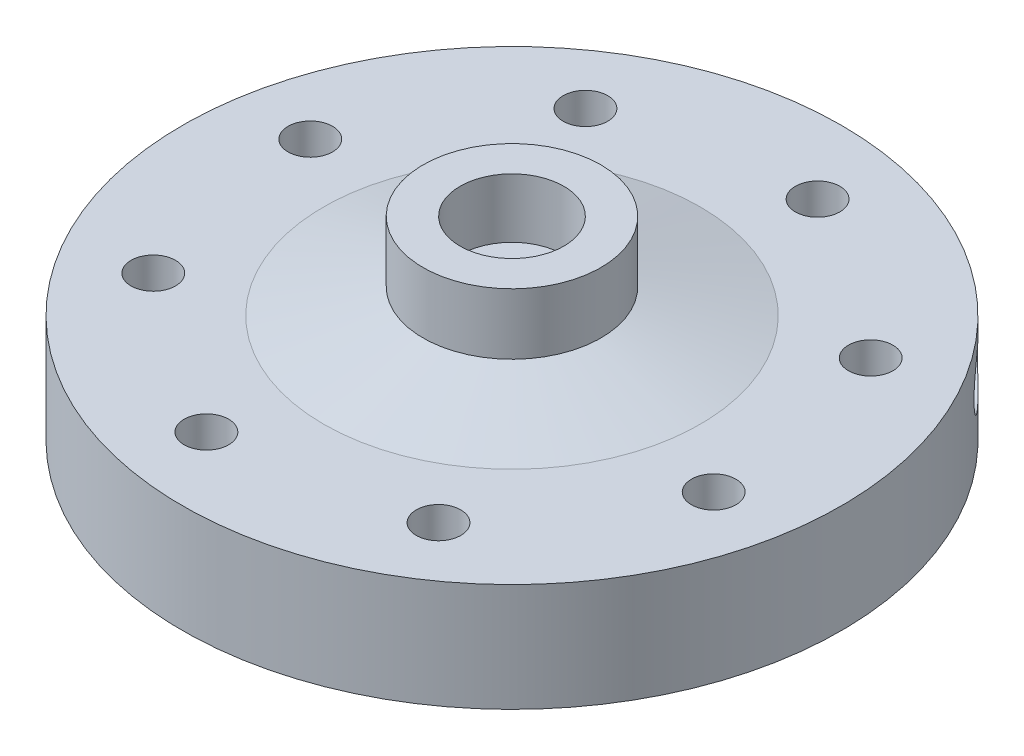
ISO-10303-21;
HEADER;
FILE_DESCRIPTION(('STEP AP214'),'2;1');
FILE_NAME('part.step','',(''),(''),'','','');
FILE_SCHEMA(('AUTOMOTIVE_DESIGN { 1 0 10303 214 1 1 1 1 }'));
ENDSEC;
DATA;
#1=APPLICATION_CONTEXT('core data for automotive mechanical design processes');
#2=APPLICATION_PROTOCOL_DEFINITION('international standard','automotive_design',2000,#1);
#3=PRODUCT_CONTEXT('',#1,'mechanical');
#4=PRODUCT('Part','Part','',(#3));
#5=PRODUCT_RELATED_PRODUCT_CATEGORY('part','',(#4));
#6=PRODUCT_DEFINITION_FORMATION('','',#4);
#7=PRODUCT_DEFINITION_CONTEXT('part definition',#1,'design');
#8=PRODUCT_DEFINITION('design','',#6,#7);
#9=PRODUCT_DEFINITION_SHAPE('','',#8);
#10=(LENGTH_UNIT() NAMED_UNIT(*) SI_UNIT(.MILLI.,.METRE.));
#11=(NAMED_UNIT(*) PLANE_ANGLE_UNIT() SI_UNIT($,.RADIAN.));
#12=(NAMED_UNIT(*) SI_UNIT($,.STERADIAN.) SOLID_ANGLE_UNIT());
#13=UNCERTAINTY_MEASURE_WITH_UNIT(LENGTH_MEASURE(1.E-05),#10,'distance_accuracy_value','');
#14=(GEOMETRIC_REPRESENTATION_CONTEXT(3) GLOBAL_UNCERTAINTY_ASSIGNED_CONTEXT((#13)) GLOBAL_UNIT_ASSIGNED_CONTEXT((#10,
#11,#12)) REPRESENTATION_CONTEXT('',''));
#15=CARTESIAN_POINT('',(0.,0.,0.));
#16=DIRECTION('',(0.,0.,1.));
#17=DIRECTION('',(1.,0.,0.));
#18=AXIS2_PLACEMENT_3D('',#15,#16,#17);
#19=CARTESIAN_POINT('',(0.,21.1893026219228,0.));
#20=DIRECTION('',(0.,1.,0.));
#21=DIRECTION('',(0.,0.,1.));
#22=AXIS2_PLACEMENT_3D('',#19,#20,#21);
#23=PLANE('',#22);
#24=CARTESIAN_POINT('',(0.,21.1893026219228,0.));
#25=DIRECTION('',(0.,1.,0.));
#26=DIRECTION('',(0.,0.,1.));
#27=AXIS2_PLACEMENT_3D('',#24,#25,#26);
#28=CIRCLE('',#27,7.);
#29=CARTESIAN_POINT('',(0.,21.1893026219228,7.));
#30=VERTEX_POINT('',#29);
#31=EDGE_CURVE('E115',#30,#30,#28,.T.);
#32=ORIENTED_EDGE('',*,*,#31,.F.);
#33=EDGE_LOOP('',(#32));
#34=FACE_BOUND('',#33,.T.);
#35=CARTESIAN_POINT('',(0.,21.1893026219228,0.));
#36=DIRECTION('',(0.,-1.,0.));
#37=DIRECTION('',(0.,0.,-1.));
#38=AXIS2_PLACEMENT_3D('',#35,#36,#37);
#39=CIRCLE('',#38,12.);
#40=CARTESIAN_POINT('',(0.,21.1893026219228,-12.));
#41=VERTEX_POINT('',#40);
#42=EDGE_CURVE('E118',#41,#41,#39,.T.);
#43=ORIENTED_EDGE('',*,*,#42,.F.);
#44=EDGE_LOOP('',(#43));
#45=FACE_BOUND('',#44,.T.);
#46=ADVANCED_FACE('F34',(#34,#45),#23,.T.);
#47=CARTESIAN_POINT('',(0.,21.1893026219228,0.));
#48=DIRECTION('',(0.,-1.,0.));
#49=DIRECTION('',(0.,0.,-1.));
#50=AXIS2_PLACEMENT_3D('',#47,#48,#49);
#51=CYLINDRICAL_SURFACE('',#50,44.45);
#52=CARTESIAN_POINT('',(0.,9.58290033894912,0.));
#53=DIRECTION('',(0.,-1.,0.));
#54=DIRECTION('',(0.,0.,-1.));
#55=AXIS2_PLACEMENT_3D('',#52,#53,#54);
#56=CIRCLE('',#55,44.45);
#57=CARTESIAN_POINT('',(0.,9.58290033894912,-44.45));
#58=VERTEX_POINT('',#57);
#59=EDGE_CURVE('E60',#58,#58,#56,.T.);
#60=ORIENTED_EDGE('',*,*,#59,.T.);
#61=EDGE_LOOP('',(#60));
#62=FACE_BOUND('',#61,.T.);
#63=CARTESIAN_POINT('',(29.9319374510654,2.92587753145361,-32.8615523130833));
#64=CARTESIAN_POINT('',(29.8959334541763,3.08996745976612,-32.8943472882046));
#65=CARTESIAN_POINT('',(29.8698406517045,3.25812870608102,-32.918012326472));
#66=CARTESIAN_POINT('',(29.8390810721533,3.59803129591487,-32.9458978715955));
#67=CARTESIAN_POINT('',(29.8344178203927,3.76977322381451,-32.9501151791572));
#68=CARTESIAN_POINT('',(29.8468160101363,4.11178029325182,-32.9388848775177));
#69=CARTESIAN_POINT('',(29.8638731600843,4.28204571982786,-32.923441152979));
#70=CARTESIAN_POINT('',(29.9186443721799,4.61634764342194,-32.8736757873706));
#71=CARTESIAN_POINT('',(29.9563617542599,4.78038313480842,-32.839351112281));
#72=CARTESIAN_POINT('',(30.0508826711284,5.10006916125842,-32.7528787338816));
#73=CARTESIAN_POINT('',(30.1079042863796,5.2555991807501,-32.7005272600508));
#74=CARTESIAN_POINT('',(30.2381423844797,5.55316359074421,-32.5801333615735));
#75=CARTESIAN_POINT('',(30.3113639334116,5.69519373962693,-32.5120860281955));
#76=CARTESIAN_POINT('',(30.479763231903,5.97825923657682,-32.354307347965));
#77=CARTESIAN_POINT('',(30.5764596653527,6.11752289202571,-32.2630261580549));
#78=CARTESIAN_POINT('',(30.7824900910937,6.37526544205093,-32.0665104857453));
#79=CARTESIAN_POINT('',(30.8918307874186,6.49373322599226,-31.9612685969425));
#80=CARTESIAN_POINT('',(31.1366204327815,6.72461375894985,-31.7229662073693));
#81=CARTESIAN_POINT('',(31.2735464781962,6.83358955534002,-31.5880895514265));
#82=CARTESIAN_POINT('',(31.5554450570525,7.02176215344529,-31.3064875020951));
#83=CARTESIAN_POINT('',(31.7004219692208,7.10094256427749,-31.159755640735));
#84=CARTESIAN_POINT('',(32.011943416216,7.23608818044641,-30.8398014219607));
#85=CARTESIAN_POINT('',(32.1790277116903,7.2882564762932,-30.6654876939502));
#86=CARTESIAN_POINT('',(32.5138613076038,7.35310948024676,-30.3102460893369));
#87=CARTESIAN_POINT('',(32.6816108145007,7.36578078148028,-30.1293159879497));
#88=CARTESIAN_POINT('',(33.0191207519525,7.35015011928141,-29.7591130066244));
#89=CARTESIAN_POINT('',(33.188749832493,7.3204148536562,-29.569768114535));
#90=CARTESIAN_POINT('',(33.4360796467411,7.24260767754938,-29.2890225263445));
#91=CARTESIAN_POINT('',(33.5173793061825,7.21111188538967,-29.1959365205569));
#92=CARTESIAN_POINT('',(33.6769987650302,7.13702521866445,-29.0116708490032));
#93=CARTESIAN_POINT('',(33.7553200979625,7.09444014505164,-28.9204902133721));
#94=CARTESIAN_POINT('',(33.9043660981399,7.00072240675448,-28.7455907940928));
#95=CARTESIAN_POINT('',(33.9752741700074,6.95014544382026,-28.6617299433563));
#96=CARTESIAN_POINT('',(34.1132151213295,6.83923725805802,-28.4974130351109));
#97=CARTESIAN_POINT('',(34.1802500245553,6.77891119296619,-28.4169552054864));
#98=CARTESIAN_POINT('',(34.3099008180338,6.64873819896556,-28.2602821797415));
#99=CARTESIAN_POINT('',(34.3725167100777,6.57889127391572,-28.1840669819015));
#100=CARTESIAN_POINT('',(34.4927226402088,6.4300914093142,-28.0368260137797));
#101=CARTESIAN_POINT('',(34.5503155400245,6.35114371502683,-27.9657972924328));
#102=CARTESIAN_POINT('',(34.6547231624174,6.19257754218728,-27.8362876716617));
#103=CARTESIAN_POINT('',(34.7020419837502,6.11373981209024,-27.7772560422544));
#104=CARTESIAN_POINT('',(34.7917209485113,5.94954751609226,-27.6648481161933));
#105=CARTESIAN_POINT('',(34.834083678742,5.86419638860673,-27.6114688707041));
#106=CARTESIAN_POINT('',(34.9134967913379,5.68756219723673,-27.5109858890268));
#107=CARTESIAN_POINT('',(34.9505484114628,5.59628052270264,-27.4638806908471));
#108=CARTESIAN_POINT('',(35.0190131261827,5.40847105486403,-27.3765282995191));
#109=CARTESIAN_POINT('',(35.0504266366752,5.31194364919806,-27.3362806005355));
#110=CARTESIAN_POINT('',(35.1048195786324,5.12313131257556,-27.2663882435744));
#111=CARTESIAN_POINT('',(35.1282976223976,5.03121914910969,-27.2361225843593));
#112=CARTESIAN_POINT('',(35.1701404712617,4.84433535731343,-27.1820692414821));
#113=CARTESIAN_POINT('',(35.1885034795302,4.74936266690679,-27.1582838342933));
#114=CARTESIAN_POINT('',(35.2199422882794,4.55717428744205,-27.1175004963679));
#115=CARTESIAN_POINT('',(35.2330217171778,4.45996018630107,-27.1004979077343));
#116=CARTESIAN_POINT('',(35.2538095071216,4.26399228899056,-27.0734499265245));
#117=CARTESIAN_POINT('',(35.2615159527482,4.16523795655616,-27.0634070150166));
#118=CARTESIAN_POINT('',(35.2759268647847,3.87824588832216,-27.0446267889823));
#119=CARTESIAN_POINT('',(35.2755800602276,3.68891581473742,-27.045078425231));
#120=CARTESIAN_POINT('',(35.2552885487423,3.3132404029546,-27.0715232177343));
#121=CARTESIAN_POINT('',(35.2353463065054,3.12689469238254,-27.0975131618104));
#122=CARTESIAN_POINT('',(35.1768155881201,2.76444513569196,-27.1734501443475));
#123=CARTESIAN_POINT('',(35.138440258913,2.58824938318097,-27.2231232799882));
#124=CARTESIAN_POINT('',(35.0442292053705,2.24852073576567,-27.3442928850559));
#125=CARTESIAN_POINT('',(34.9883922771803,2.08498871490699,-27.4157908591443));
#126=CARTESIAN_POINT('',(34.8590672833632,1.77032966578616,-27.5800489677924));
#127=CARTESIAN_POINT('',(34.7851472492575,1.61965113561621,-27.673326412974));
#128=CARTESIAN_POINT('',(34.622491300943,1.33900342439487,-27.8765584735258));
#129=CARTESIAN_POINT('',(34.5337521580806,1.20903876838094,-27.9865167226795));
#130=CARTESIAN_POINT('',(34.3379189149704,0.964943060613875,-28.2264977777086));
#131=CARTESIAN_POINT('',(34.2300405121252,0.852240006286304,-28.3573308024269));
#132=CARTESIAN_POINT('',(34.0028439200075,0.654273227869451,-28.6293648562107));
#133=CARTESIAN_POINT('',(33.8835218692917,0.569018808384937,-28.7705693811537));
#134=CARTESIAN_POINT('',(33.6256520454255,0.420598608588096,-29.0716443283033));
#135=CARTESIAN_POINT('',(33.4863321649852,0.359925539813118,-29.2320812637325));
#136=CARTESIAN_POINT('',(33.2008489713714,0.271723014815587,-29.5559266302383));
#137=CARTESIAN_POINT('',(33.0546829288822,0.244206895929537,-29.7193362302542));
#138=CARTESIAN_POINT('',(32.7454881577216,0.220807889053222,-30.0598228667674));
#139=CARTESIAN_POINT('',(32.5821242336938,0.227989055384148,-30.2368088545413));
#140=CARTESIAN_POINT('',(32.2553656514553,0.280109390675425,-30.5851436417432));
#141=CARTESIAN_POINT('',(32.0919710057033,0.325063125869894,-30.7564902399605));
#142=CARTESIAN_POINT('',(31.7601930789528,0.4553140902387,-31.0990779130803));
#143=CARTESIAN_POINT('',(31.5920629140525,0.542781776902442,-31.2697467802407));
#144=CARTESIAN_POINT('',(31.2661896539131,0.757461981556021,-31.595586148521));
#145=CARTESIAN_POINT('',(31.1084523797953,0.884696547893698,-31.750747988787));
#146=CARTESIAN_POINT('',(30.8134603284424,1.17404865265958,-32.0370780643059));
#147=CARTESIAN_POINT('',(30.6758106429551,1.33527404813061,-32.1687253302455));
#148=CARTESIAN_POINT('',(30.4873832922621,1.60201806266462,-32.3470171245173));
#149=CARTESIAN_POINT('',(30.4276096519339,1.69502637528039,-32.403225837649));
#150=CARTESIAN_POINT('',(30.3150011493385,1.88887178247535,-32.5086007664093));
#151=CARTESIAN_POINT('',(30.2621626771096,1.98970476023799,-32.5577706471782));
#152=CARTESIAN_POINT('',(30.1529366173993,2.223170449247,-32.6589912460298));
#153=CARTESIAN_POINT('',(30.0986472162477,2.35769714973743,-32.7089900365473));
#154=CARTESIAN_POINT('',(30.0042468891101,2.63569252042126,-32.7956061393647));
#155=CARTESIAN_POINT('',(29.9641302036493,2.77915753033937,-32.8322288875945));
#156=CARTESIAN_POINT('',(29.9319374510654,2.92587753145361,-32.8615523130833));
#157=B_SPLINE_CURVE_WITH_KNOTS('',3,(#63,#64,#65,#66,#67,#68,#69,#70,#71,#72,#73,#74,#75,#76,
#77,#78,#79,#80,#81,#82,#83,#84,#85,#86,#87,#88,#89,#90,#91,#92,#93,#94,#95,#96,#97,#98,#99,
#100,#101,#102,#103,#104,#105,#106,#107,#108,#109,#110,#111,#112,#113,#114,#115,#116,#117,#118,
#119,#120,#121,#122,#123,#124,#125,#126,#127,#128,#129,#130,#131,#132,#133,#134,#135,#136,#137,
#138,#139,#140,#141,#142,#143,#144,#145,#146,#147,#148,#149,#150,#151,#152,#153,#154,#155,#156),
.UNSPECIFIED.,.T.,.F.,(4,2,2,2,2,2,2,2,2,2,2,2,2,2,2,2,2,2,2,2,2,2,2,2,2,2,2,2,2,2,2,2,2,2,2,2,
2,2,2,2,2,2,2,2,2,2,4),(0.,0.512983526291553,1.02605143912919,1.5390179948069,2.05206700425608,
2.57111687231475,3.09032928892595,3.66574133435212,4.24145987632443,4.90162429314794,
5.56215134711368,6.29990989555231,7.03791884174703,7.80147096809877,8.18366046760571,
8.5656504388618,8.92789252925978,9.28994360008619,9.65199452416818,10.0138378123539,
10.3412017483519,10.6683940490911,10.9955099729083,11.3226017569496,11.6209454963744,
11.9193939074082,12.2176370136856,12.5159863865856,13.0809840490645,13.6459106558944,
14.2044566072901,14.7630410750054,15.3365583590146,15.9102007591943,16.518445955294,
17.1268971192689,17.7870535587685,18.4474754567192,19.1672303089605,19.8872628476867,
20.6486836420955,21.4105273497708,22.1544280659116,22.5259744743772,22.8973267083056,
23.3561944648806,23.8148755327749),.UNSPECIFIED.);
#158=CARTESIAN_POINT('',(29.9319374510654,2.92587753145361,-32.8615523130833));
#159=VERTEX_POINT('',#158);
#160=EDGE_CURVE('E59',#159,#159,#157,.T.);
#161=ORIENTED_EDGE('',*,*,#160,.F.);
#162=EDGE_LOOP('',(#161));
#163=FACE_BOUND('',#162,.T.);
#164=CARTESIAN_POINT('',(0.,-5.,0.));
#165=DIRECTION('',(0.,-1.,0.));
#166=DIRECTION('',(0.,0.,-1.));
#167=AXIS2_PLACEMENT_3D('',#164,#165,#166);
#168=CIRCLE('',#167,44.45);
#169=CARTESIAN_POINT('',(0.,-5.,-44.45));
#170=VERTEX_POINT('',#169);
#171=EDGE_CURVE('E121',#170,#170,#168,.T.);
#172=ORIENTED_EDGE('',*,*,#171,.F.);
#173=EDGE_LOOP('',(#172));
#174=FACE_BOUND('',#173,.T.);
#175=ADVANCED_FACE('F36',(#62,#163,#174),#51,.T.);
#176=CARTESIAN_POINT('',(0.,4.5875,0.));
#177=DIRECTION('',(0.,-1.,0.));
#178=DIRECTION('',(0.,0.,-1.));
#179=AXIS2_PLACEMENT_3D('',#176,#177,#178);
#180=CONICAL_SURFACE('',#179,22.09,1.32418092378547);
#181=CARTESIAN_POINT('',(0.,9.18930262192282,0.));
#182=DIRECTION('',(0.,-1.,0.));
#183=DIRECTION('',(0.,0.,-1.));
#184=AXIS2_PLACEMENT_3D('',#181,#182,#183);
#185=CIRCLE('',#184,3.81);
#186=CARTESIAN_POINT('',(0.,9.18930262192282,-3.81));
#187=VERTEX_POINT('',#186);
#188=EDGE_CURVE('E64',#187,#187,#185,.F.);
#189=ORIENTED_EDGE('',*,*,#188,.T.);
#190=EDGE_LOOP('',(#189));
#191=FACE_BOUND('',#190,.T.);
#192=CARTESIAN_POINT('',(6.13562550996568,4.38066795586843,-22.07478197908));
#193=CARTESIAN_POINT('',(5.98457562506494,4.3947043940381,-22.0588943145366));
#194=CARTESIAN_POINT('',(5.83341847908548,4.40827683708233,-22.0435935078896));
#195=CARTESIAN_POINT('',(5.53084598354515,4.43442905340862,-22.0143528826941));
#196=CARTESIAN_POINT('',(5.37943057561923,4.44700855954939,-22.0004134301688));
#197=CARTESIAN_POINT('',(5.07941561153341,4.47086118692307,-21.9743552701809));
#198=CARTESIAN_POINT('',(4.93082043780428,4.48215543700558,-21.9622056717629));
#199=CARTESIAN_POINT('',(4.63344350202329,4.50362877140248,-21.9396901814164));
#200=CARTESIAN_POINT('',(4.48466178533523,4.51380808773956,-21.9293239181106));
#201=CARTESIAN_POINT('',(4.23008020024855,4.53015105360158,-21.9135020524442));
#202=CARTESIAN_POINT('',(4.12433452802815,4.53662288732904,-21.9074943238424));
#203=CARTESIAN_POINT('',(3.91268229409887,4.54887619703796,-21.896840523297));
#204=CARTESIAN_POINT('',(3.80677567980164,4.55465734335439,-21.892195100055));
#205=CARTESIAN_POINT('',(3.59312730792132,4.56551751151255,-21.8845653203958));
#206=CARTESIAN_POINT('',(3.48538384597303,4.57058351420876,-21.8816093519997));
#207=CARTESIAN_POINT('',(3.26997606591197,4.5797386957489,-21.8780634364602));
#208=CARTESIAN_POINT('',(3.16231188818478,4.58382939224546,-21.8774697904688));
#209=CARTESIAN_POINT('',(2.96956655164748,4.59004241604126,-21.8794608647767));
#210=CARTESIAN_POINT('',(2.8844868051626,4.59239765516121,-21.8814048446465));
#211=CARTESIAN_POINT('',(2.71396545956979,4.59610817164843,-21.8883575543552));
#212=CARTESIAN_POINT('',(2.62852422871071,4.59745828638689,-21.893381868507));
#213=CARTESIAN_POINT('',(2.50166359246883,4.59833297254636,-21.9046160931611));
#214=CARTESIAN_POINT('',(2.46008034764081,4.59843806703666,-21.9089051734947));
#215=CARTESIAN_POINT('',(2.3770338795782,4.59816863184853,-21.9191474562208));
#216=CARTESIAN_POINT('',(2.33557098477726,4.59779327877395,-21.9251035017944));
#217=CARTESIAN_POINT('',(2.25344122356953,4.59637747060184,-21.9393500219083));
#218=CARTESIAN_POINT('',(2.21277055887236,4.59534294106575,-21.9476193339018));
#219=CARTESIAN_POINT('',(2.1324042700357,4.59227482370265,-21.9678171930921));
#220=CARTESIAN_POINT('',(2.09270548830103,4.59024510752564,-21.9797314929088));
#221=CARTESIAN_POINT('',(2.04752452919717,4.58676911279619,-21.99781974435));
#222=CARTESIAN_POINT('',(2.04067014629176,4.58620848093233,-22.0006932031921));
#223=CARTESIAN_POINT('',(2.02707120620181,4.58501481514265,-22.0067120674605));
#224=CARTESIAN_POINT('',(2.0203269094564,4.58438163185855,-22.00985803051));
#225=CARTESIAN_POINT('',(2.00293988608634,4.5826243099241,-22.018458357985));
#226=CARTESIAN_POINT('',(1.9924193015073,4.5814356877385,-22.0241535407557));
#227=CARTESIAN_POINT('',(1.97203738793139,4.57879803557561,-22.0365074694565));
#228=CARTESIAN_POINT('',(1.96217391973181,4.57734991357236,-22.0431628404076));
#229=CARTESIAN_POINT('',(1.94333534257334,4.57410231344171,-22.0577822112795));
#230=CARTESIAN_POINT('',(1.93436891153792,4.57229982593736,-22.0657573199079));
#231=CARTESIAN_POINT('',(1.91801588676003,4.56826428333015,-22.0832761001863));
#232=CARTESIAN_POINT('',(1.91065177728583,4.56602584444708,-22.0928391381788));
#233=CARTESIAN_POINT('',(1.90451701869548,4.5635482617385,-22.103245610301));
#234=B_SPLINE_CURVE_WITH_KNOTS('',3,(#192,#193,#194,#195,#196,#197,#198,#199,#200,#201,#202,
#203,#204,#205,#206,#207,#208,#209,#210,#211,#212,#213,#214,#215,#216,#217,#218,#219,#220,#221,
#222,#223,#224,#225,#226,#227,#228,#229,#230,#231,#232,#233),.UNSPECIFIED.,.F.,.F.,(4,2,2,2,2,2,
2,2,2,2,2,2,2,2,2,2,2,2,2,2,4),(0.,0.457592779417192,0.915308253641029,1.36385062713709,
1.81229947889206,2.13063203689364,2.4491159330624,2.77280488937222,3.09598682410706,
3.35135976877424,3.6080355055304,3.73342667449992,3.85903302819576,3.98352589396955,
4.10753823323847,4.12989278684285,4.15229421682781,4.18831188171032,4.22420589988034,
4.2604190455396,4.29711156215241),.UNSPECIFIED.);
#235=CARTESIAN_POINT('',(3.04841907212211,4.5875,-21.8786480651964));
#236=VERTEX_POINT('',#235);
#237=CARTESIAN_POINT('',(2.05704997366814,4.5875,-21.9940138539065));
#238=VERTEX_POINT('',#237);
#239=EDGE_CURVE('E50',#236,#238,#234,.T.);
#240=ORIENTED_EDGE('',*,*,#239,.F.);
#241=CARTESIAN_POINT('',(0.,4.5875,0.));
#242=DIRECTION('',(0.,-1.,0.));
#243=DIRECTION('',(0.,0.,-1.));
#244=AXIS2_PLACEMENT_3D('',#241,#242,#243);
#245=CIRCLE('',#244,22.09);
#246=EDGE_CURVE('E44',#236,#238,#245,.T.);
#247=ORIENTED_EDGE('',*,*,#246,.T.);
#248=EDGE_LOOP('',(#240,#247));
#249=FACE_BOUND('',#248,.T.);
#250=ADVANCED_FACE('F58',(#191,#249),#180,.F.);
#251=CARTESIAN_POINT('',(0.,0.,0.));
#252=DIRECTION('',(0.,-1.,0.));
#253=DIRECTION('',(0.,0.,-1.));
#254=AXIS2_PLACEMENT_3D('',#251,#252,#253);
#255=CYLINDRICAL_SURFACE('',#254,22.09);
#256=CARTESIAN_POINT('',(3.0462567307584,4.58769999999999,-21.8789492419154));
#257=CARTESIAN_POINT('',(2.91230666329947,4.60006056999422,-21.8975992770266));
#258=CARTESIAN_POINT('',(2.77767464506814,4.60663492161683,-21.9150872715687));
#259=CARTESIAN_POINT('',(2.50792095952043,4.61019133568592,-21.9475948071694));
#260=CARTESIAN_POINT('',(2.372798982332,4.60716556772945,-21.9626123226591));
#261=CARTESIAN_POINT('',(2.10254440985668,4.59252330428507,-21.9901316375328));
#262=CARTESIAN_POINT('',(1.96741219197172,4.58089211897604,-22.002629088579));
#263=CARTESIAN_POINT('',(1.6979650202327,4.54937379456902,-22.0250600389683));
#264=CARTESIAN_POINT('',(1.56364963280025,4.5294915108316,-22.0349950406194));
#265=CARTESIAN_POINT('',(1.36391661785739,4.49321463211701,-22.0479530136967));
#266=CARTESIAN_POINT('',(1.2979486138166,4.4801265516513,-22.0519333911045));
#267=CARTESIAN_POINT('',(1.16648687469734,4.45161717345571,-22.0592778564191));
#268=CARTESIAN_POINT('',(1.10099308658513,4.43619614098944,-22.0626420142958));
#269=CARTESIAN_POINT('',(0.970673100002186,4.402743727085,-22.0687594954394));
#270=CARTESIAN_POINT('',(0.905846604174828,4.38471356750516,-22.0715131031079));
#271=CARTESIAN_POINT('',(0.777130424723753,4.34556287336326,-22.0764198985649));
#272=CARTESIAN_POINT('',(0.713240408148012,4.32444346797626,-22.0785733049057));
#273=CARTESIAN_POINT('',(0.586671674764934,4.27824984073979,-22.0822988393563));
#274=CARTESIAN_POINT('',(0.523996166199485,4.25316641912413,-22.0838695861064));
#275=CARTESIAN_POINT('',(0.43189755821909,4.21148356018877,-22.0857988122912));
#276=CARTESIAN_POINT('',(0.401553219275602,4.19693333022417,-22.0863702978074));
#277=CARTESIAN_POINT('',(0.341737187141,4.16614447160144,-22.0873766496354));
#278=CARTESIAN_POINT('',(0.312265034170529,4.14990675364485,-22.0878115891338));
#279=CARTESIAN_POINT('',(0.260236955045294,4.11864716450581,-22.0884792554287));
#280=CARTESIAN_POINT('',(0.237453949466789,4.1040066546476,-22.0887348815528));
#281=CARTESIAN_POINT('',(0.193043780762426,4.07290331340054,-22.0891676456247));
#282=CARTESIAN_POINT('',(0.171420100283218,4.05643540265978,-22.0893445575908));
#283=CARTESIAN_POINT('',(0.12983022614744,4.02098044049271,-22.0896283626633));
#284=CARTESIAN_POINT('',(0.109888808591993,4.00196382561992,-22.0897343299549));
#285=CARTESIAN_POINT('',(0.0734127365118833,3.96089970344517,-22.0898854126113));
#286=CARTESIAN_POINT('',(0.0568592288860999,3.93887017432474,-22.089930872936));
#287=CARTESIAN_POINT('',(0.0366622404675388,3.90342357265302,-22.0899706281644));
#288=CARTESIAN_POINT('',(0.0307342614854408,3.89132319506826,-22.0899791858719));
#289=CARTESIAN_POINT('',(0.0207858494291629,3.86635707803128,-22.0899907742783));
#290=CARTESIAN_POINT('',(0.0167631917557431,3.85349225098773,-22.0899938114345));
#291=CARTESIAN_POINT('',(0.0110179262127915,3.82711663602452,-22.0899974540813));
#292=CARTESIAN_POINT('',(0.00931713715361736,3.81360093959067,-22.0899980366105));
#293=CARTESIAN_POINT('',(0.00852083462815383,3.78649204086169,-22.0899983626076));
#294=CARTESIAN_POINT('',(0.0094247633894373,3.77289885578205,-22.0899981062553));
#295=CARTESIAN_POINT('',(0.0134933312386624,3.74745006630363,-22.0899959512429));
#296=CARTESIAN_POINT('',(0.016425494186002,3.73555559261887,-22.0899942175495));
#297=CARTESIAN_POINT('',(0.0240100878797386,3.71233413488834,-22.0899872781889));
#298=CARTESIAN_POINT('',(0.0286636513712897,3.70100753010681,-22.0899820702336));
#299=CARTESIAN_POINT('',(0.0427512674985429,3.67204527944813,-22.0899603279853));
#300=CARTESIAN_POINT('',(0.0533435494645209,3.65497732614604,-22.0899386975075));
#301=CARTESIAN_POINT('',(0.0769695633089485,3.62262591024199,-22.0898691167767));
#302=CARTESIAN_POINT('',(0.0900113383709599,3.60734860377142,-22.0898210787809));
#303=CARTESIAN_POINT('',(0.131338784380429,3.5639707783109,-22.0896263933826));
#304=CARTESIAN_POINT('',(0.161950178561927,3.53812135581597,-22.0894292102885));
#305=CARTESIAN_POINT('',(0.226152839595284,3.49051742730241,-22.0888660959423));
#306=CARTESIAN_POINT('',(0.259753375172906,3.46877636103858,-22.0884996239117));
#307=CARTESIAN_POINT('',(0.323903471107627,3.43104380520367,-22.0876451532462));
#308=CARTESIAN_POINT('',(0.354232300602894,3.41467298845438,-22.0871809714602));
#309=CARTESIAN_POINT('',(0.415757839661146,3.38364484457781,-22.0861086410202));
#310=CARTESIAN_POINT('',(0.446954985405625,3.36898839858851,-22.085500418815));
#311=CARTESIAN_POINT('',(0.541568503146697,3.32703493923199,-22.0834503450056));
#312=CARTESIAN_POINT('',(0.605898544158609,3.30181367092026,-22.0817844642887));
#313=CARTESIAN_POINT('',(0.736250932968316,3.25523587683586,-22.0778241731844));
#314=CARTESIAN_POINT('',(0.80228025838852,3.23389979725259,-22.0755265887588));
#315=CARTESIAN_POINT('',(0.935184802467352,3.19445128767109,-22.0702955824052));
#316=CARTESIAN_POINT('',(1.00205902071783,3.17633536945259,-22.0673628562278));
#317=CARTESIAN_POINT('',(1.14696216147988,3.14018669711536,-22.0603406730031));
#318=CARTESIAN_POINT('',(1.22509903535079,3.1226105752596,-22.056142020063));
#319=CARTESIAN_POINT('',(1.38197777789973,3.09065454651507,-22.0468686537224));
#320=CARTESIAN_POINT('',(1.46071975491929,3.07627522647921,-22.0417937797729));
#321=CARTESIAN_POINT('',(1.69777208272619,3.03754348565145,-22.0252301898657));
#322=CARTESIAN_POINT('',(1.8567336923455,3.01763948693553,-22.0124109099193));
#323=CARTESIAN_POINT('',(2.17489133145564,2.98941830797579,-21.9832525114926));
#324=CARTESIAN_POINT('',(2.33408524190546,2.9810666901992,-21.9669240228059));
#325=CARTESIAN_POINT('',(2.57259283378477,2.97806127922755,-21.9398329582197));
#326=CARTESIAN_POINT('',(2.65200946836885,2.97864387520538,-21.9303747960885));
#327=CARTESIAN_POINT('',(2.81063130315882,2.98327534496314,-21.9106100902335));
#328=CARTESIAN_POINT('',(2.88983653555659,2.98732365674834,-21.9003036843043));
#329=CARTESIAN_POINT('',(3.0491342262156,2.99938203765265,-21.878698451166));
#330=CARTESIAN_POINT('',(3.12922018843483,3.00745541253064,-21.8673862192969));
#331=CARTESIAN_POINT('',(3.28866962087578,3.02818673416886,-21.8439748942513));
#332=CARTESIAN_POINT('',(3.36803332375296,3.0408431468795,-21.8318760654777));
#333=CARTESIAN_POINT('',(3.52570344039664,3.07161246856335,-21.8069689403109));
#334=CARTESIAN_POINT('',(3.60400843556967,3.08973206146861,-21.7941597906306));
#335=CARTESIAN_POINT('',(3.75864882066234,3.13266170562415,-21.7680219521443));
#336=CARTESIAN_POINT('',(3.8349866131339,3.15746312625533,-21.7546939523805));
#337=CARTESIAN_POINT('',(3.94731740649763,3.20132146063098,-21.7344947473072));
#338=CARTESIAN_POINT('',(3.98458476282252,3.21714939675154,-21.7276915245846));
#339=CARTESIAN_POINT('',(4.0579049031665,3.25139767068496,-21.7141173693639));
#340=CARTESIAN_POINT('',(4.0939584106459,3.26981642919874,-21.7073464197734));
#341=CARTESIAN_POINT('',(4.16412118950123,3.30958023307525,-21.6939959716545));
#342=CARTESIAN_POINT('',(4.19824250546758,3.33090344412218,-21.6874154512969));
#343=CARTESIAN_POINT('',(4.26399148768257,3.37714197919567,-21.6745839937951));
#344=CARTESIAN_POINT('',(4.29562404016933,3.40204997842176,-21.6683324192497));
#345=CARTESIAN_POINT('',(4.34528097119904,3.44721825701922,-21.6584174966514));
#346=CARTESIAN_POINT('',(4.36434536553727,3.46629025512948,-21.6545820774625));
#347=CARTESIAN_POINT('',(4.40020542874842,3.506599762904,-21.6473237625031));
#348=CARTESIAN_POINT('',(4.41699890855262,3.52783932790057,-21.6439012651099));
#349=CARTESIAN_POINT('',(4.44762168629193,3.57282241967445,-21.6376294581059));
#350=CARTESIAN_POINT('',(4.46141678037525,3.59659065425839,-21.6347867832297));
#351=CARTESIAN_POINT('',(4.48466267031112,3.64624794851485,-21.6299802039331));
#352=CARTESIAN_POINT('',(4.49412362842884,3.67213187767657,-21.6280142441661));
#353=CARTESIAN_POINT('',(4.50607291870213,3.71927000866921,-21.6255273972918));
#354=CARTESIAN_POINT('',(4.5096596703865,3.74023294328893,-21.6247791331715));
#355=CARTESIAN_POINT('',(4.51328114126508,3.78247601316998,-21.6240236147277));
#356=CARTESIAN_POINT('',(4.51331777339833,3.80375597142403,-21.6240159613351));
#357=CARTESIAN_POINT('',(4.50983798013251,3.84597940279756,-21.6247419427776));
#358=CARTESIAN_POINT('',(4.50632552098154,3.86692322501916,-21.6254747501189));
#359=CARTESIAN_POINT('',(4.49607359820904,3.90796693869327,-21.6276084937678));
#360=CARTESIAN_POINT('',(4.4893314632599,3.92806611652794,-21.6290099831515));
#361=CARTESIAN_POINT('',(4.47008259718362,3.97436080354453,-21.6329976948572));
#362=CARTESIAN_POINT('',(4.45636322039204,4.00002803813065,-21.6358309252007));
#363=CARTESIAN_POINT('',(4.42510568948582,4.04880756130768,-21.642245626435));
#364=CARTESIAN_POINT('',(4.40755890220002,4.07191389284515,-21.6458287881314));
#365=CARTESIAN_POINT('',(4.35792494794064,4.12932874962608,-21.6558897606514));
#366=CARTESIAN_POINT('',(4.32360347322792,4.16161461085991,-21.6627772226974));
#367=CARTESIAN_POINT('',(4.25072148931843,4.22076057618838,-21.6771968372208));
#368=CARTESIAN_POINT('',(4.2121494954464,4.24760539504935,-21.684730723527));
#369=CARTESIAN_POINT('',(4.13278343716221,4.29661902818696,-21.6999957885162));
#370=CARTESIAN_POINT('',(4.09201647201567,4.31883332100433,-21.7077241218104));
#371=CARTESIAN_POINT('',(4.00873836163681,4.35971683531684,-21.7232575749424));
#372=CARTESIAN_POINT('',(3.96622551238145,4.37838248820961,-21.7310627638608));
#373=CARTESIAN_POINT('',(3.83683543801471,4.42997986893195,-21.7544122221687));
#374=CARTESIAN_POINT('',(3.74817858182652,4.45847125287625,-21.7698764667585));
#375=CARTESIAN_POINT('',(3.55834856616231,4.50941254965031,-21.8017562183019));
#376=CARTESIAN_POINT('',(3.45689451662817,4.53081366227958,-21.8180812843453));
#377=CARTESIAN_POINT('',(3.25251365452413,4.56518640232849,-21.849483818232));
#378=CARTESIAN_POINT('',(3.1495881017484,4.57816484508779,-21.8645622861369));
#379=CARTESIAN_POINT('',(3.0462567307584,4.58769999999999,-21.8789492419154));
#380=B_SPLINE_CURVE_WITH_KNOTS('',3,(#256,#257,#258,#259,#260,#261,#262,#263,#264,#265,#266,
#267,#268,#269,#270,#271,#272,#273,#274,#275,#276,#277,#278,#279,#280,#281,#282,#283,#284,#285,
#286,#287,#288,#289,#290,#291,#292,#293,#294,#295,#296,#297,#298,#299,#300,#301,#302,#303,#304,
#305,#306,#307,#308,#309,#310,#311,#312,#313,#314,#315,#316,#317,#318,#319,#320,#321,#322,#323,
#324,#325,#326,#327,#328,#329,#330,#331,#332,#333,#334,#335,#336,#337,#338,#339,#340,#341,#342,
#343,#344,#345,#346,#347,#348,#349,#350,#351,#352,#353,#354,#355,#356,#357,#358,#359,#360,#361,
#362,#363,#364,#365,#366,#367,#368,#369,#370,#371,#372,#373,#374,#375,#376,#377,#378,#379),
.UNSPECIFIED.,.T.,.F.,(4,2,2,2,2,2,2,2,2,2,2,2,2,2,2,2,2,2,2,2,2,2,2,2,2,2,2,2,2,2,2,2,2,2,2,2,
2,2,2,2,2,2,2,2,2,2,2,2,2,2,2,2,2,2,2,2,2,2,2,2,2,4),(0.,0.407317984541277,0.814968286155931,
1.2233160747906,1.63142391104657,1.8335032672262,2.03555966362388,2.23752174108497,
2.43941018138233,2.64177424187953,2.74270871445117,2.84358899494879,2.92477767708448,
3.00619796422425,3.08866107342444,3.17065200413389,3.21095111599127,3.25120305904696,
3.29183070826938,3.33244965816238,3.36905055519555,3.40567557994043,3.46558813299977,
3.52570096847052,3.64523151355165,3.76514655727483,3.86847721624674,3.97186075303217,
4.17899788839086,4.38719544265396,4.59516607523871,4.83568112894835,5.07624029881958,
5.55789814244293,6.03811705178574,6.27799251763497,6.51782909304357,6.76156277545371,
7.00521494981832,7.24916643864599,7.49280432450024,7.61589924104635,7.73891944465921,
7.86106122049899,7.98295687681568,8.06452843513452,8.14617807294547,8.22871521606198,
8.31105783085549,8.37461147537984,8.43813087460013,8.5015793668359,8.56508042940563,
8.65230891809462,8.7397362338077,8.88179634572114,9.02425017097925,9.16523106574631,
9.30635299312518,9.58884591374228,9.90331274154927,10.2175247951149),.UNSPECIFIED.);
#381=EDGE_CURVE('E11',#238,#236,#380,.T.);
#382=ORIENTED_EDGE('',*,*,#381,.F.);
#383=ORIENTED_EDGE('',*,*,#246,.F.);
#384=EDGE_LOOP('',(#382,#383));
#385=FACE_BOUND('',#384,.T.);
#386=CARTESIAN_POINT('',(0.,-5.,0.));
#387=DIRECTION('',(0.,-1.,0.));
#388=DIRECTION('',(0.,0.,-1.));
#389=AXIS2_PLACEMENT_3D('',#386,#387,#388);
#390=CIRCLE('',#389,22.09);
#391=CARTESIAN_POINT('',(0.,-5.,-22.09));
#392=VERTEX_POINT('',#391);
#393=EDGE_CURVE('E127',#392,#392,#390,.T.);
#394=ORIENTED_EDGE('',*,*,#393,.T.);
#395=EDGE_LOOP('',(#394));
#396=FACE_BOUND('',#395,.T.);
#397=ADVANCED_FACE('F62',(#385,#396),#255,.F.);
#398=CARTESIAN_POINT('',(0.,-78.8106973780772,0.));
#399=DIRECTION('',(0.,1.,0.));
#400=DIRECTION('',(0.,0.,1.));
#401=AXIS2_PLACEMENT_3D('',#398,#399,#400);
#402=CYLINDRICAL_SURFACE('',#401,3.81);
#403=ORIENTED_EDGE('',*,*,#188,.F.);
#404=EDGE_LOOP('',(#403));
#405=FACE_BOUND('',#404,.T.);
#406=CARTESIAN_POINT('',(0.,13.1893026219228,0.));
#407=DIRECTION('',(0.,1.,0.));
#408=DIRECTION('',(0.,0.,1.));
#409=AXIS2_PLACEMENT_3D('',#406,#407,#408);
#410=CIRCLE('',#409,3.81);
#411=CARTESIAN_POINT('',(0.,13.1893026219228,3.81));
#412=VERTEX_POINT('',#411);
#413=EDGE_CURVE('E67',#412,#412,#410,.F.);
#414=ORIENTED_EDGE('',*,*,#413,.F.);
#415=EDGE_LOOP('',(#414));
#416=FACE_BOUND('',#415,.T.);
#417=ADVANCED_FACE('F228',(#405,#416),#402,.F.);
#418=CARTESIAN_POINT('',(0.,13.1893026219228,0.));
#419=DIRECTION('',(0.,1.,0.));
#420=DIRECTION('',(0.,0.,1.));
#421=AXIS2_PLACEMENT_3D('',#418,#419,#420);
#422=PLANE('',#421);
#423=CARTESIAN_POINT('',(0.,13.1893026219228,0.));
#424=DIRECTION('',(0.,1.,0.));
#425=DIRECTION('',(0.,0.,1.));
#426=AXIS2_PLACEMENT_3D('',#423,#424,#425);
#427=CIRCLE('',#426,7.);
#428=CARTESIAN_POINT('',(0.,13.1893026219228,7.));
#429=VERTEX_POINT('',#428);
#430=EDGE_CURVE('E72',#429,#429,#427,.T.);
#431=ORIENTED_EDGE('',*,*,#430,.T.);
#432=EDGE_LOOP('',(#431));
#433=FACE_BOUND('',#432,.T.);
#434=ORIENTED_EDGE('',*,*,#413,.T.);
#435=EDGE_LOOP('',(#434));
#436=FACE_BOUND('',#435,.T.);
#437=ADVANCED_FACE('F90',(#433,#436),#422,.T.);
#438=CARTESIAN_POINT('',(0.,13.1893026219228,0.));
#439=DIRECTION('',(0.,1.,0.));
#440=DIRECTION('',(0.,0.,1.));
#441=AXIS2_PLACEMENT_3D('',#438,#439,#440);
#442=CYLINDRICAL_SURFACE('',#441,7.);
#443=ORIENTED_EDGE('',*,*,#430,.F.);
#444=EDGE_LOOP('',(#443));
#445=FACE_BOUND('',#444,.T.);
#446=ORIENTED_EDGE('',*,*,#31,.T.);
#447=EDGE_LOOP('',(#446));
#448=FACE_BOUND('',#447,.T.);
#449=ADVANCED_FACE('F88',(#445,#448),#442,.F.);
#450=CARTESIAN_POINT('',(96.225018689906,3.79374999999999,-47.2262450243045));
#451=DIRECTION('',(0.965925826289069,0.,-0.258819045102517));
#452=DIRECTION('',(-0.258819045102517,0.,-0.965925826289069));
#453=AXIS2_PLACEMENT_3D('',#450,#451,#452);
#454=CONICAL_SURFACE('',#453,9.32300711862051,0.0872664625997166);
#455=ORIENTED_EDGE('',*,*,#239,.T.);
#456=ORIENTED_EDGE('',*,*,#381,.T.);
#457=EDGE_LOOP('',(#455,#456));
#458=FACE_BOUND('',#457,.T.);
#459=ORIENTED_EDGE('',*,*,#160,.T.);
#460=EDGE_LOOP('',(#459));
#461=FACE_BOUND('',#460,.T.);
#462=ADVANCED_FACE('F52',(#458,#461),#454,.F.);
#463=CARTESIAN_POINT('',(25.4,9.58290033894912,0.));
#464=DIRECTION('',(0.,-1.,0.));
#465=DIRECTION('',(0.,0.,-1.));
#466=AXIS2_PLACEMENT_3D('',#463,#464,#465);
#467=PLANE('',#466);
#468=CARTESIAN_POINT('',(29.1484131990415,9.58290033894912,-19.2386494582635));
#469=DIRECTION('',(0.,-1.,0.));
#470=DIRECTION('',(0.,0.,-1.));
#471=AXIS2_PLACEMENT_3D('',#468,#469,#470);
#472=CIRCLE('',#471,3.00000000000001);
#473=CARTESIAN_POINT('',(29.1484131990415,9.58290033894912,-22.2386494582635));
#474=VERTEX_POINT('',#473);
#475=EDGE_CURVE('E148',#474,#474,#472,.T.);
#476=ORIENTED_EDGE('',*,*,#475,.T.);
#477=EDGE_LOOP('',(#476));
#478=FACE_BOUND('',#477,.T.);
#479=CARTESIAN_POINT('',(34.2148201266787,9.58290033894912,7.00726114106076));
#480=DIRECTION('',(0.,-1.,0.));
#481=DIRECTION('',(0.,0.,-1.));
#482=AXIS2_PLACEMENT_3D('',#479,#480,#481);
#483=CIRCLE('',#482,3.00000000000001);
#484=CARTESIAN_POINT('',(34.2148201266787,9.58290033894912,4.00726114106076));
#485=VERTEX_POINT('',#484);
#486=EDGE_CURVE('E152',#485,#485,#483,.T.);
#487=ORIENTED_EDGE('',*,*,#486,.T.);
#488=EDGE_LOOP('',(#487));
#489=FACE_BOUND('',#488,.T.);
#490=CARTESIAN_POINT('',(19.2386494582634,9.58290033894912,29.1484131990416));
#491=DIRECTION('',(0.,-1.,0.));
#492=DIRECTION('',(0.,0.,-1.));
#493=AXIS2_PLACEMENT_3D('',#490,#491,#492);
#494=CIRCLE('',#493,3.00000000000001);
#495=CARTESIAN_POINT('',(19.2386494582634,9.58290033894912,26.1484131990416));
#496=VERTEX_POINT('',#495);
#497=EDGE_CURVE('E156',#496,#496,#494,.T.);
#498=ORIENTED_EDGE('',*,*,#497,.T.);
#499=EDGE_LOOP('',(#498));
#500=FACE_BOUND('',#499,.T.);
#501=CARTESIAN_POINT('',(-7.00726114106112,9.58290033894912,34.2148201266787));
#502=DIRECTION('',(0.,-1.,0.));
#503=DIRECTION('',(0.,0.,-1.));
#504=AXIS2_PLACEMENT_3D('',#501,#502,#503);
#505=CIRCLE('',#504,3.00000000000001);
#506=CARTESIAN_POINT('',(-7.00726114106112,9.58290033894912,31.2148201266787));
#507=VERTEX_POINT('',#506);
#508=EDGE_CURVE('E160',#507,#507,#505,.T.);
#509=ORIENTED_EDGE('',*,*,#508,.T.);
#510=EDGE_LOOP('',(#509));
#511=FACE_BOUND('',#510,.T.);
#512=CARTESIAN_POINT('',(-29.1484131990417,9.58290033894912,19.2386494582633));
#513=DIRECTION('',(0.,-1.,0.));
#514=DIRECTION('',(0.,0.,-1.));
#515=AXIS2_PLACEMENT_3D('',#512,#513,#514);
#516=CIRCLE('',#515,3.00000000000001);
#517=CARTESIAN_POINT('',(-29.1484131990417,9.58290033894912,16.2386494582633));
#518=VERTEX_POINT('',#517);
#519=EDGE_CURVE('E164',#518,#518,#516,.T.);
#520=ORIENTED_EDGE('',*,*,#519,.T.);
#521=EDGE_LOOP('',(#520));
#522=FACE_BOUND('',#521,.T.);
#523=CARTESIAN_POINT('',(-34.2148201266787,9.58290033894912,-7.007261141061));
#524=DIRECTION('',(0.,-1.,0.));
#525=DIRECTION('',(0.,0.,-1.));
#526=AXIS2_PLACEMENT_3D('',#523,#524,#525);
#527=CIRCLE('',#526,3.00000000000001);
#528=CARTESIAN_POINT('',(-34.2148201266787,9.58290033894912,-10.007261141061));
#529=VERTEX_POINT('',#528);
#530=EDGE_CURVE('E168',#529,#529,#527,.T.);
#531=ORIENTED_EDGE('',*,*,#530,.T.);
#532=EDGE_LOOP('',(#531));
#533=FACE_BOUND('',#532,.T.);
#534=CARTESIAN_POINT('',(-19.2386494582632,9.58290033894912,-29.1484131990417));
#535=DIRECTION('',(0.,-1.,0.));
#536=DIRECTION('',(0.,0.,-1.));
#537=AXIS2_PLACEMENT_3D('',#534,#535,#536);
#538=CIRCLE('',#537,3.00000000000001);
#539=CARTESIAN_POINT('',(-19.2386494582632,9.58290033894912,-32.1484131990417));
#540=VERTEX_POINT('',#539);
#541=EDGE_CURVE('E172',#540,#540,#538,.T.);
#542=ORIENTED_EDGE('',*,*,#541,.T.);
#543=EDGE_LOOP('',(#542));
#544=FACE_BOUND('',#543,.T.);
#545=CARTESIAN_POINT('',(7.00726114106112,9.58290033894912,-34.2148201266787));
#546=DIRECTION('',(0.,-1.,0.));
#547=DIRECTION('',(0.,0.,-1.));
#548=AXIS2_PLACEMENT_3D('',#545,#546,#547);
#549=CIRCLE('',#548,3.00000000000001);
#550=CARTESIAN_POINT('',(7.00726114106112,9.58290033894912,-37.2148201266787));
#551=VERTEX_POINT('',#550);
#552=EDGE_CURVE('E175',#551,#551,#549,.T.);
#553=ORIENTED_EDGE('',*,*,#552,.T.);
#554=EDGE_LOOP('',(#553));
#555=FACE_BOUND('',#554,.T.);
#556=ORIENTED_EDGE('',*,*,#59,.F.);
#557=EDGE_LOOP('',(#556));
#558=FACE_BOUND('',#557,.T.);
#559=CARTESIAN_POINT('',(0.,9.58290033894912,0.));
#560=DIRECTION('',(0.,-1.,0.));
#561=DIRECTION('',(0.,0.,-1.));
#562=AXIS2_PLACEMENT_3D('',#559,#560,#561);
#563=CIRCLE('',#562,25.4);
#564=CARTESIAN_POINT('',(0.,9.58290033894912,-25.4));
#565=VERTEX_POINT('',#564);
#566=EDGE_CURVE('E124',#565,#565,#563,.T.);
#567=ORIENTED_EDGE('',*,*,#566,.T.);
#568=EDGE_LOOP('',(#567));
#569=FACE_BOUND('',#568,.T.);
#570=ADVANCED_FACE('F87',(#478,#489,#500,#511,#522,#533,#544,#555,#558,#569),#467,.F.);
#571=CARTESIAN_POINT('',(0.,12.9562129830282,0.));
#572=DIRECTION('',(0.,-1.,0.));
#573=DIRECTION('',(0.,0.,-1.));
#574=AXIS2_PLACEMENT_3D('',#571,#572,#573);
#575=CONICAL_SURFACE('',#574,12.,1.32418092378547);
#576=ORIENTED_EDGE('',*,*,#566,.F.);
#577=EDGE_LOOP('',(#576));
#578=FACE_BOUND('',#577,.T.);
#579=CARTESIAN_POINT('',(0.,12.9562129830282,0.));
#580=DIRECTION('',(0.,-1.,0.));
#581=DIRECTION('',(0.,0.,-1.));
#582=AXIS2_PLACEMENT_3D('',#579,#580,#581);
#583=CIRCLE('',#582,12.);
#584=CARTESIAN_POINT('',(0.,12.9562129830282,-12.));
#585=VERTEX_POINT('',#584);
#586=EDGE_CURVE('E120',#585,#585,#583,.T.);
#587=ORIENTED_EDGE('',*,*,#586,.T.);
#588=EDGE_LOOP('',(#587));
#589=FACE_BOUND('',#588,.T.);
#590=ADVANCED_FACE('F138',(#578,#589),#575,.T.);
#591=CARTESIAN_POINT('',(0.,0.,0.));
#592=DIRECTION('',(0.,-1.,0.));
#593=DIRECTION('',(0.,0.,-1.));
#594=AXIS2_PLACEMENT_3D('',#591,#592,#593);
#595=CYLINDRICAL_SURFACE('',#594,12.);
#596=ORIENTED_EDGE('',*,*,#586,.F.);
#597=EDGE_LOOP('',(#596));
#598=FACE_BOUND('',#597,.T.);
#599=ORIENTED_EDGE('',*,*,#42,.T.);
#600=EDGE_LOOP('',(#599));
#601=FACE_BOUND('',#600,.T.);
#602=ADVANCED_FACE('F143',(#598,#601),#595,.T.);
#603=CARTESIAN_POINT('',(0.,-5.,0.));
#604=DIRECTION('',(0.,-1.,0.));
#605=DIRECTION('',(0.,0.,-1.));
#606=AXIS2_PLACEMENT_3D('',#603,#604,#605);
#607=PLANE('',#606);
#608=CARTESIAN_POINT('',(29.1484131990415,-5.,-19.2386494582635));
#609=DIRECTION('',(0.,-1.,0.));
#610=DIRECTION('',(0.,0.,-1.));
#611=AXIS2_PLACEMENT_3D('',#608,#609,#610);
#612=CIRCLE('',#611,3.00000000000001);
#613=CARTESIAN_POINT('',(29.1484131990415,-5.,-22.2386494582635));
#614=VERTEX_POINT('',#613);
#615=EDGE_CURVE('E39',#614,#614,#612,.T.);
#616=ORIENTED_EDGE('',*,*,#615,.F.);
#617=EDGE_LOOP('',(#616));
#618=FACE_BOUND('',#617,.T.);
#619=CARTESIAN_POINT('',(34.2148201266787,-5.,7.00726114106076));
#620=DIRECTION('',(0.,-1.,0.));
#621=DIRECTION('',(0.,0.,-1.));
#622=AXIS2_PLACEMENT_3D('',#619,#620,#621);
#623=CIRCLE('',#622,3.00000000000001);
#624=CARTESIAN_POINT('',(34.2148201266787,-5.,4.00726114106076));
#625=VERTEX_POINT('',#624);
#626=EDGE_CURVE('E192',#625,#625,#623,.T.);
#627=ORIENTED_EDGE('',*,*,#626,.F.);
#628=EDGE_LOOP('',(#627));
#629=FACE_BOUND('',#628,.T.);
#630=CARTESIAN_POINT('',(19.2386494582634,-5.,29.1484131990416));
#631=DIRECTION('',(0.,-1.,0.));
#632=DIRECTION('',(0.,0.,-1.));
#633=AXIS2_PLACEMENT_3D('',#630,#631,#632);
#634=CIRCLE('',#633,3.00000000000001);
#635=CARTESIAN_POINT('',(19.2386494582634,-5.,26.1484131990416));
#636=VERTEX_POINT('',#635);
#637=EDGE_CURVE('E190',#636,#636,#634,.T.);
#638=ORIENTED_EDGE('',*,*,#637,.F.);
#639=EDGE_LOOP('',(#638));
#640=FACE_BOUND('',#639,.T.);
#641=CARTESIAN_POINT('',(-7.00726114106112,-5.,34.2148201266787));
#642=DIRECTION('',(0.,-1.,0.));
#643=DIRECTION('',(0.,0.,-1.));
#644=AXIS2_PLACEMENT_3D('',#641,#642,#643);
#645=CIRCLE('',#644,3.00000000000001);
#646=CARTESIAN_POINT('',(-7.00726114106112,-5.,31.2148201266787));
#647=VERTEX_POINT('',#646);
#648=EDGE_CURVE('E188',#647,#647,#645,.T.);
#649=ORIENTED_EDGE('',*,*,#648,.F.);
#650=EDGE_LOOP('',(#649));
#651=FACE_BOUND('',#650,.T.);
#652=CARTESIAN_POINT('',(-29.1484131990417,-5.,19.2386494582633));
#653=DIRECTION('',(0.,-1.,0.));
#654=DIRECTION('',(0.,0.,-1.));
#655=AXIS2_PLACEMENT_3D('',#652,#653,#654);
#656=CIRCLE('',#655,3.00000000000001);
#657=CARTESIAN_POINT('',(-29.1484131990417,-5.,16.2386494582633));
#658=VERTEX_POINT('',#657);
#659=EDGE_CURVE('E186',#658,#658,#656,.T.);
#660=ORIENTED_EDGE('',*,*,#659,.F.);
#661=EDGE_LOOP('',(#660));
#662=FACE_BOUND('',#661,.T.);
#663=CARTESIAN_POINT('',(-34.2148201266787,-5.,-7.007261141061));
#664=DIRECTION('',(0.,-1.,0.));
#665=DIRECTION('',(0.,0.,-1.));
#666=AXIS2_PLACEMENT_3D('',#663,#664,#665);
#667=CIRCLE('',#666,3.00000000000001);
#668=CARTESIAN_POINT('',(-34.2148201266787,-5.,-10.007261141061));
#669=VERTEX_POINT('',#668);
#670=EDGE_CURVE('E184',#669,#669,#667,.T.);
#671=ORIENTED_EDGE('',*,*,#670,.F.);
#672=EDGE_LOOP('',(#671));
#673=FACE_BOUND('',#672,.T.);
#674=CARTESIAN_POINT('',(-19.2386494582632,-5.,-29.1484131990417));
#675=DIRECTION('',(0.,-1.,0.));
#676=DIRECTION('',(0.,0.,-1.));
#677=AXIS2_PLACEMENT_3D('',#674,#675,#676);
#678=CIRCLE('',#677,3.00000000000001);
#679=CARTESIAN_POINT('',(-19.2386494582632,-5.,-32.1484131990417));
#680=VERTEX_POINT('',#679);
#681=EDGE_CURVE('E182',#680,#680,#678,.T.);
#682=ORIENTED_EDGE('',*,*,#681,.F.);
#683=EDGE_LOOP('',(#682));
#684=FACE_BOUND('',#683,.T.);
#685=CARTESIAN_POINT('',(7.00726114106112,-5.,-34.2148201266787));
#686=DIRECTION('',(0.,-1.,0.));
#687=DIRECTION('',(0.,0.,-1.));
#688=AXIS2_PLACEMENT_3D('',#685,#686,#687);
#689=CIRCLE('',#688,3.00000000000001);
#690=CARTESIAN_POINT('',(7.00726114106112,-5.,-37.2148201266787));
#691=VERTEX_POINT('',#690);
#692=EDGE_CURVE('E78',#691,#691,#689,.T.);
#693=ORIENTED_EDGE('',*,*,#692,.F.);
#694=EDGE_LOOP('',(#693));
#695=FACE_BOUND('',#694,.T.);
#696=ORIENTED_EDGE('',*,*,#171,.T.);
#697=EDGE_LOOP('',(#696));
#698=FACE_BOUND('',#697,.T.);
#699=ORIENTED_EDGE('',*,*,#393,.F.);
#700=EDGE_LOOP('',(#699));
#701=FACE_BOUND('',#700,.T.);
#702=ADVANCED_FACE('F200',(#618,#629,#640,#651,#662,#673,#684,#695,#698,#701),#607,.T.);
#703=CARTESIAN_POINT('',(7.00726114106112,-78.8106973780772,-34.2148201266787));
#704=DIRECTION('',(0.,1.,0.));
#705=DIRECTION('',(0.,0.,1.));
#706=AXIS2_PLACEMENT_3D('',#703,#704,#705);
#707=CYLINDRICAL_SURFACE('',#706,3.00000000000001);
#708=ORIENTED_EDGE('',*,*,#692,.T.);
#709=EDGE_LOOP('',(#708));
#710=FACE_BOUND('',#709,.T.);
#711=ORIENTED_EDGE('',*,*,#552,.F.);
#712=EDGE_LOOP('',(#711));
#713=FACE_BOUND('',#712,.T.);
#714=ADVANCED_FACE('F203',(#710,#713),#707,.F.);
#715=CARTESIAN_POINT('',(-19.2386494582632,-78.8106973780772,-29.1484131990417));
#716=DIRECTION('',(0.,1.,0.));
#717=DIRECTION('',(0.,0.,1.));
#718=AXIS2_PLACEMENT_3D('',#715,#716,#717);
#719=CYLINDRICAL_SURFACE('',#718,3.00000000000001);
#720=ORIENTED_EDGE('',*,*,#681,.T.);
#721=EDGE_LOOP('',(#720));
#722=FACE_BOUND('',#721,.T.);
#723=ORIENTED_EDGE('',*,*,#541,.F.);
#724=EDGE_LOOP('',(#723));
#725=FACE_BOUND('',#724,.T.);
#726=ADVANCED_FACE('F301',(#722,#725),#719,.F.);
#727=CARTESIAN_POINT('',(-34.2148201266787,-78.8106973780772,-7.007261141061));
#728=DIRECTION('',(0.,1.,0.));
#729=DIRECTION('',(0.,0.,1.));
#730=AXIS2_PLACEMENT_3D('',#727,#728,#729);
#731=CYLINDRICAL_SURFACE('',#730,3.00000000000001);
#732=ORIENTED_EDGE('',*,*,#670,.T.);
#733=EDGE_LOOP('',(#732));
#734=FACE_BOUND('',#733,.T.);
#735=ORIENTED_EDGE('',*,*,#530,.F.);
#736=EDGE_LOOP('',(#735));
#737=FACE_BOUND('',#736,.T.);
#738=ADVANCED_FACE('F320',(#734,#737),#731,.F.);
#739=CARTESIAN_POINT('',(-29.1484131990417,-78.8106973780772,19.2386494582633));
#740=DIRECTION('',(0.,1.,0.));
#741=DIRECTION('',(0.,0.,1.));
#742=AXIS2_PLACEMENT_3D('',#739,#740,#741);
#743=CYLINDRICAL_SURFACE('',#742,3.00000000000001);
#744=ORIENTED_EDGE('',*,*,#659,.T.);
#745=EDGE_LOOP('',(#744));
#746=FACE_BOUND('',#745,.T.);
#747=ORIENTED_EDGE('',*,*,#519,.F.);
#748=EDGE_LOOP('',(#747));
#749=FACE_BOUND('',#748,.T.);
#750=ADVANCED_FACE('F330',(#746,#749),#743,.F.);
#751=CARTESIAN_POINT('',(-7.00726114106112,-78.8106973780772,34.2148201266787));
#752=DIRECTION('',(0.,1.,0.));
#753=DIRECTION('',(0.,0.,1.));
#754=AXIS2_PLACEMENT_3D('',#751,#752,#753);
#755=CYLINDRICAL_SURFACE('',#754,3.00000000000001);
#756=ORIENTED_EDGE('',*,*,#648,.T.);
#757=EDGE_LOOP('',(#756));
#758=FACE_BOUND('',#757,.T.);
#759=ORIENTED_EDGE('',*,*,#508,.F.);
#760=EDGE_LOOP('',(#759));
#761=FACE_BOUND('',#760,.T.);
#762=ADVANCED_FACE('F340',(#758,#761),#755,.F.);
#763=CARTESIAN_POINT('',(19.2386494582634,-78.8106973780772,29.1484131990416));
#764=DIRECTION('',(0.,1.,0.));
#765=DIRECTION('',(0.,0.,1.));
#766=AXIS2_PLACEMENT_3D('',#763,#764,#765);
#767=CYLINDRICAL_SURFACE('',#766,3.00000000000001);
#768=ORIENTED_EDGE('',*,*,#637,.T.);
#769=EDGE_LOOP('',(#768));
#770=FACE_BOUND('',#769,.T.);
#771=ORIENTED_EDGE('',*,*,#497,.F.);
#772=EDGE_LOOP('',(#771));
#773=FACE_BOUND('',#772,.T.);
#774=ADVANCED_FACE('F350',(#770,#773),#767,.F.);
#775=CARTESIAN_POINT('',(34.2148201266787,-78.8106973780772,7.00726114106076));
#776=DIRECTION('',(0.,1.,0.));
#777=DIRECTION('',(0.,0.,1.));
#778=AXIS2_PLACEMENT_3D('',#775,#776,#777);
#779=CYLINDRICAL_SURFACE('',#778,3.00000000000001);
#780=ORIENTED_EDGE('',*,*,#626,.T.);
#781=EDGE_LOOP('',(#780));
#782=FACE_BOUND('',#781,.T.);
#783=ORIENTED_EDGE('',*,*,#486,.F.);
#784=EDGE_LOOP('',(#783));
#785=FACE_BOUND('',#784,.T.);
#786=ADVANCED_FACE('F360',(#782,#785),#779,.F.);
#787=CARTESIAN_POINT('',(29.1484131990415,-78.8106973780772,-19.2386494582635));
#788=DIRECTION('',(0.,1.,0.));
#789=DIRECTION('',(0.,0.,1.));
#790=AXIS2_PLACEMENT_3D('',#787,#788,#789);
#791=CYLINDRICAL_SURFACE('',#790,3.00000000000001);
#792=ORIENTED_EDGE('',*,*,#615,.T.);
#793=EDGE_LOOP('',(#792));
#794=FACE_BOUND('',#793,.T.);
#795=ORIENTED_EDGE('',*,*,#475,.F.);
#796=EDGE_LOOP('',(#795));
#797=FACE_BOUND('',#796,.T.);
#798=ADVANCED_FACE('F197',(#794,#797),#791,.F.);
#799=CLOSED_SHELL('',(#46,#175,#250,#397,#417,#437,#449,#462,#570,#590,#602,#702,#714,#726,#738,
#750,#762,#774,#786,#798));
#800=MANIFOLD_SOLID_BREP('B2',#799);
#801=ADVANCED_BREP_SHAPE_REPRESENTATION('',(#18,#800),#14);
#802=SHAPE_DEFINITION_REPRESENTATION(#9,#801);
ENDSEC;
END-ISO-10303-21;
